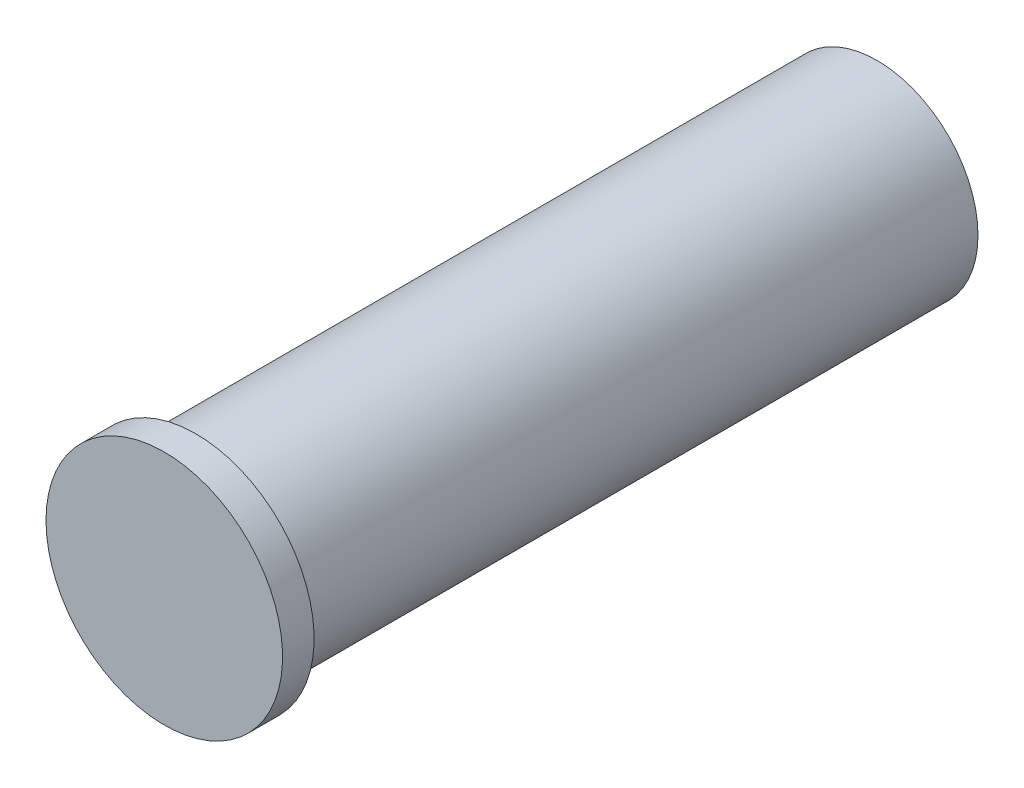
ISO-10303-21;
HEADER;
FILE_DESCRIPTION(('STEP AP214'),'2;1');
FILE_NAME('part.step','',(''),(''),'','','');
FILE_SCHEMA(('AUTOMOTIVE_DESIGN { 1 0 10303 214 1 1 1 1 }'));
ENDSEC;
DATA;
#1=APPLICATION_CONTEXT('core data for automotive mechanical design processes');
#2=APPLICATION_PROTOCOL_DEFINITION('international standard','automotive_design',2000,#1);
#3=PRODUCT_CONTEXT('',#1,'mechanical');
#4=PRODUCT('Part','Part','',(#3));
#5=PRODUCT_RELATED_PRODUCT_CATEGORY('part','',(#4));
#6=PRODUCT_DEFINITION_FORMATION('','',#4);
#7=PRODUCT_DEFINITION_CONTEXT('part definition',#1,'design');
#8=PRODUCT_DEFINITION('design','',#6,#7);
#9=PRODUCT_DEFINITION_SHAPE('','',#8);
#10=(LENGTH_UNIT() NAMED_UNIT(*) SI_UNIT(.MILLI.,.METRE.));
#11=(NAMED_UNIT(*) PLANE_ANGLE_UNIT() SI_UNIT($,.RADIAN.));
#12=(NAMED_UNIT(*) SI_UNIT($,.STERADIAN.) SOLID_ANGLE_UNIT());
#13=UNCERTAINTY_MEASURE_WITH_UNIT(LENGTH_MEASURE(1.E-05),#10,'distance_accuracy_value','');
#14=(GEOMETRIC_REPRESENTATION_CONTEXT(3) GLOBAL_UNCERTAINTY_ASSIGNED_CONTEXT((#13)) GLOBAL_UNIT_ASSIGNED_CONTEXT((#10,
#11,#12)) REPRESENTATION_CONTEXT('',''));
#15=CARTESIAN_POINT('',(0.,0.,0.));
#16=DIRECTION('',(0.,0.,1.));
#17=DIRECTION('',(1.,0.,0.));
#18=AXIS2_PLACEMENT_3D('',#15,#16,#17);
#19=CARTESIAN_POINT('',(0.,0.,0.));
#20=DIRECTION('',(0.,0.,1.));
#21=DIRECTION('',(1.,0.,0.));
#22=AXIS2_PLACEMENT_3D('',#19,#20,#21);
#23=PLANE('',#22);
#24=CARTESIAN_POINT('',(0.,0.,0.));
#25=DIRECTION('',(0.,0.,1.));
#26=DIRECTION('',(1.,0.,0.));
#27=AXIS2_PLACEMENT_3D('',#24,#25,#26);
#28=CIRCLE('',#27,3.048);
#29=CARTESIAN_POINT('',(3.048,0.,0.));
#30=VERTEX_POINT('',#29);
#31=EDGE_CURVE('E35',#30,#30,#28,.T.);
#32=ORIENTED_EDGE('',*,*,#31,.F.);
#33=EDGE_LOOP('',(#32));
#34=FACE_BOUND('',#33,.T.);
#35=CARTESIAN_POINT('',(0.,0.,0.));
#36=DIRECTION('',(0.,0.,1.));
#37=DIRECTION('',(1.,0.,0.));
#38=AXIS2_PLACEMENT_3D('',#35,#36,#37);
#39=CIRCLE('',#38,1.4605);
#40=CARTESIAN_POINT('',(1.4605,0.,0.));
#41=VERTEX_POINT('',#40);
#42=EDGE_CURVE('E42',#41,#41,#39,.T.);
#43=ORIENTED_EDGE('',*,*,#42,.T.);
#44=EDGE_LOOP('',(#43));
#45=FACE_BOUND('',#44,.T.);
#46=ADVANCED_FACE('F31',(#34,#45),#23,.F.);
#47=CARTESIAN_POINT('',(0.,0.,20.574));
#48=DIRECTION('',(0.,0.,-1.));
#49=DIRECTION('',(-1.,0.,0.));
#50=AXIS2_PLACEMENT_3D('',#47,#48,#49);
#51=CYLINDRICAL_SURFACE('',#50,3.048);
#52=CARTESIAN_POINT('',(0.,0.,20.574));
#53=DIRECTION('',(0.,0.,1.));
#54=DIRECTION('',(1.,0.,0.));
#55=AXIS2_PLACEMENT_3D('',#52,#53,#54);
#56=CIRCLE('',#55,3.048);
#57=CARTESIAN_POINT('',(3.048,0.,20.574));
#58=VERTEX_POINT('',#57);
#59=EDGE_CURVE('E10',#58,#58,#56,.T.);
#60=ORIENTED_EDGE('',*,*,#59,.F.);
#61=EDGE_LOOP('',(#60));
#62=FACE_BOUND('',#61,.T.);
#63=ORIENTED_EDGE('',*,*,#31,.T.);
#64=EDGE_LOOP('',(#63));
#65=FACE_BOUND('',#64,.T.);
#66=ADVANCED_FACE('F33',(#62,#65),#51,.T.);
#67=CARTESIAN_POINT('',(0.,0.,20.574));
#68=DIRECTION('',(0.,0.,-1.));
#69=DIRECTION('',(-1.,0.,0.));
#70=AXIS2_PLACEMENT_3D('',#67,#68,#69);
#71=CYLINDRICAL_SURFACE('',#70,1.4605);
#72=CARTESIAN_POINT('',(0.,0.,20.574));
#73=DIRECTION('',(0.,0.,1.));
#74=DIRECTION('',(1.,0.,0.));
#75=AXIS2_PLACEMENT_3D('',#72,#73,#74);
#76=CIRCLE('',#75,1.4605);
#77=CARTESIAN_POINT('',(1.4605,0.,20.574));
#78=VERTEX_POINT('',#77);
#79=EDGE_CURVE('E46',#78,#78,#76,.T.);
#80=ORIENTED_EDGE('',*,*,#79,.T.);
#81=EDGE_LOOP('',(#80));
#82=FACE_BOUND('',#81,.T.);
#83=ORIENTED_EDGE('',*,*,#42,.F.);
#84=EDGE_LOOP('',(#83));
#85=FACE_BOUND('',#84,.T.);
#86=ADVANCED_FACE('F73',(#82,#85),#71,.F.);
#87=CARTESIAN_POINT('',(0.,0.,20.574));
#88=DIRECTION('',(0.,0.,1.));
#89=DIRECTION('',(1.,0.,0.));
#90=AXIS2_PLACEMENT_3D('',#87,#88,#89);
#91=PLANE('',#90);
#92=ORIENTED_EDGE('',*,*,#79,.F.);
#93=EDGE_LOOP('',(#92));
#94=FACE_BOUND('',#93,.T.);
#95=ADVANCED_FACE('F61',(#94),#91,.F.);
#96=CARTESIAN_POINT('',(0.,0.,21.5265));
#97=DIRECTION('',(0.,0.,-1.));
#98=DIRECTION('',(-1.,0.,0.));
#99=AXIS2_PLACEMENT_3D('',#96,#97,#98);
#100=CYLINDRICAL_SURFACE('',#99,3.571875);
#101=CARTESIAN_POINT('',(0.,0.,21.5265));
#102=DIRECTION('',(0.,0.,1.));
#103=DIRECTION('',(1.,0.,0.));
#104=AXIS2_PLACEMENT_3D('',#101,#102,#103);
#105=CIRCLE('',#104,3.571875);
#106=CARTESIAN_POINT('',(-3.571875,0.,21.5265));
#107=VERTEX_POINT('',#106);
#108=EDGE_CURVE('E49',#107,#107,#105,.T.);
#109=CARTESIAN_POINT('',(0.,0.,20.574));
#110=DIRECTION('',(0.,0.,1.));
#111=DIRECTION('',(1.,0.,0.));
#112=AXIS2_PLACEMENT_3D('',#109,#110,#111);
#113=CIRCLE('',#112,3.571875);
#114=CARTESIAN_POINT('',(-3.571875,0.,20.574));
#115=VERTEX_POINT('',#114);
#116=EDGE_CURVE('E50',#115,#115,#113,.T.);
#117=CARTESIAN_POINT('',(-3.571875,0.,21.5265));
#118=CARTESIAN_POINT('',(-3.571875,0.,21.516578125));
#119=CARTESIAN_POINT('',(-3.571875,0.,21.50665625));
#120=CARTESIAN_POINT('',(-3.571875,0.,21.4868125));
#121=CARTESIAN_POINT('',(-3.571875,0.,21.476890625));
#122=CARTESIAN_POINT('',(-3.571875,0.,21.457046875));
#123=CARTESIAN_POINT('',(-3.571875,0.,21.447125));
#124=CARTESIAN_POINT('',(-3.571875,0.,21.42728125));
#125=CARTESIAN_POINT('',(-3.571875,0.,21.417359375));
#126=CARTESIAN_POINT('',(-3.571875,0.,21.397515625));
#127=CARTESIAN_POINT('',(-3.571875,0.,21.38759375));
#128=CARTESIAN_POINT('',(-3.571875,0.,21.36775));
#129=CARTESIAN_POINT('',(-3.571875,0.,21.357828125));
#130=CARTESIAN_POINT('',(-3.571875,0.,21.337984375));
#131=CARTESIAN_POINT('',(-3.571875,0.,21.3280625));
#132=CARTESIAN_POINT('',(-3.571875,0.,21.30821875));
#133=CARTESIAN_POINT('',(-3.571875,0.,21.298296875));
#134=CARTESIAN_POINT('',(-3.571875,0.,21.278453125));
#135=CARTESIAN_POINT('',(-3.571875,0.,21.26853125));
#136=CARTESIAN_POINT('',(-3.571875,0.,21.2486875));
#137=CARTESIAN_POINT('',(-3.571875,0.,21.238765625));
#138=CARTESIAN_POINT('',(-3.571875,0.,21.218921875));
#139=CARTESIAN_POINT('',(-3.571875,0.,21.209));
#140=CARTESIAN_POINT('',(-3.571875,0.,21.18915625));
#141=CARTESIAN_POINT('',(-3.571875,0.,21.179234375));
#142=CARTESIAN_POINT('',(-3.571875,0.,21.159390625));
#143=CARTESIAN_POINT('',(-3.571875,0.,21.14946875));
#144=CARTESIAN_POINT('',(-3.571875,0.,21.129625));
#145=CARTESIAN_POINT('',(-3.571875,0.,21.119703125));
#146=CARTESIAN_POINT('',(-3.571875,0.,21.099859375));
#147=CARTESIAN_POINT('',(-3.571875,0.,21.0899375));
#148=CARTESIAN_POINT('',(-3.571875,0.,21.07009375));
#149=CARTESIAN_POINT('',(-3.571875,0.,21.060171875));
#150=CARTESIAN_POINT('',(-3.571875,0.,21.040328125));
#151=CARTESIAN_POINT('',(-3.571875,0.,21.03040625));
#152=CARTESIAN_POINT('',(-3.571875,0.,21.0105625));
#153=CARTESIAN_POINT('',(-3.571875,0.,21.000640625));
#154=CARTESIAN_POINT('',(-3.571875,0.,20.980796875));
#155=CARTESIAN_POINT('',(-3.571875,0.,20.970875));
#156=CARTESIAN_POINT('',(-3.571875,0.,20.95103125));
#157=CARTESIAN_POINT('',(-3.571875,0.,20.941109375));
#158=CARTESIAN_POINT('',(-3.571875,0.,20.921265625));
#159=CARTESIAN_POINT('',(-3.571875,0.,20.91134375));
#160=CARTESIAN_POINT('',(-3.571875,0.,20.8915));
#161=CARTESIAN_POINT('',(-3.571875,0.,20.881578125));
#162=CARTESIAN_POINT('',(-3.571875,0.,20.861734375));
#163=CARTESIAN_POINT('',(-3.571875,0.,20.8518125));
#164=CARTESIAN_POINT('',(-3.571875,0.,20.83196875));
#165=CARTESIAN_POINT('',(-3.571875,0.,20.822046875));
#166=CARTESIAN_POINT('',(-3.571875,0.,20.802203125));
#167=CARTESIAN_POINT('',(-3.571875,0.,20.79228125));
#168=CARTESIAN_POINT('',(-3.571875,0.,20.7724375));
#169=CARTESIAN_POINT('',(-3.571875,0.,20.762515625));
#170=CARTESIAN_POINT('',(-3.571875,0.,20.742671875));
#171=CARTESIAN_POINT('',(-3.571875,0.,20.73275));
#172=CARTESIAN_POINT('',(-3.571875,0.,20.71290625));
#173=CARTESIAN_POINT('',(-3.571875,0.,20.702984375));
#174=CARTESIAN_POINT('',(-3.571875,0.,20.683140625));
#175=CARTESIAN_POINT('',(-3.571875,0.,20.67321875));
#176=CARTESIAN_POINT('',(-3.571875,0.,20.653375));
#177=CARTESIAN_POINT('',(-3.571875,0.,20.643453125));
#178=CARTESIAN_POINT('',(-3.571875,0.,20.623609375));
#179=CARTESIAN_POINT('',(-3.571875,0.,20.6136875));
#180=CARTESIAN_POINT('',(-3.571875,0.,20.59384375));
#181=CARTESIAN_POINT('',(-3.571875,0.,20.583921875));
#182=CARTESIAN_POINT('',(-3.571875,0.,20.574));
#183=B_SPLINE_CURVE_WITH_KNOTS('',3,(#117,#118,#119,#120,#121,#122,#123,#124,#125,#126,#127,
#128,#129,#130,#131,#132,#133,#134,#135,#136,#137,#138,#139,#140,#141,#142,#143,#144,#145,#146,
#147,#148,#149,#150,#151,#152,#153,#154,#155,#156,#157,#158,#159,#160,#161,#162,#163,#164,#165,
#166,#167,#168,#169,#170,#171,#172,#173,#174,#175,#176,#177,#178,#179,#180,#181,#182),
.UNSPECIFIED.,.F.,.F.,(4,2,2,2,2,2,2,2,2,2,2,2,2,2,2,2,2,2,2,2,2,2,2,2,2,2,2,2,2,2,2,2,4),(0.,
0.0297656250000007,0.0595312500000014,0.0892968750000021,0.119062500000003,0.148828125,
0.178593750000001,0.208359375000002,0.238125000000002,0.267890625000003,0.29765625,
0.327421875000001,0.357187500000002,0.386953125000002,0.41671875,0.446484375,0.476250000000001,
0.506015625000002,0.535781250000002,0.565546875,0.5953125,0.625078125000001,0.654843750000002,
0.684609374999999,0.714375,0.744140625,0.773906250000001,0.803671875000002,0.833437499999999,
0.863203125,0.892968750000001,0.922734375000001,0.952500000000002),.UNSPECIFIED.);
#184=EDGE_CURVE('BSEAM58',#107,#115,#183,.T.);
#185=ORIENTED_EDGE('',*,*,#108,.F.);
#186=ORIENTED_EDGE('',*,*,#116,.T.);
#187=ORIENTED_EDGE('',*,*,#184,.T.);
#188=ORIENTED_EDGE('',*,*,#184,.F.);
#189=EDGE_LOOP('',(#185,#187,#186,#188));
#190=FACE_BOUND('',#189,.T.);
#191=ADVANCED_FACE('F58',(#190),#100,.T.);
#192=CARTESIAN_POINT('',(0.,0.,21.5265));
#193=DIRECTION('',(0.,0.,1.));
#194=DIRECTION('',(1.,0.,0.));
#195=AXIS2_PLACEMENT_3D('',#192,#193,#194);
#196=PLANE('',#195);
#197=ORIENTED_EDGE('',*,*,#108,.T.);
#198=EDGE_LOOP('',(#197));
#199=FACE_BOUND('',#198,.T.);
#200=ADVANCED_FACE('F56',(#199),#196,.T.);
#201=ORIENTED_EDGE('',*,*,#59,.T.);
#202=EDGE_LOOP('',(#201));
#203=FACE_BOUND('',#202,.T.);
#204=ORIENTED_EDGE('',*,*,#116,.F.);
#205=EDGE_LOOP('',(#204));
#206=FACE_BOUND('',#205,.T.);
#207=ADVANCED_FACE('F65',(#203,#206),#91,.F.);
#208=CLOSED_SHELL('',(#46,#66,#86,#95,#191,#200,#207));
#209=MANIFOLD_SOLID_BREP('B2',#208);
#210=ADVANCED_BREP_SHAPE_REPRESENTATION('',(#18,#209),#14);
#211=SHAPE_DEFINITION_REPRESENTATION(#9,#210);
ENDSEC;
END-ISO-10303-21;
